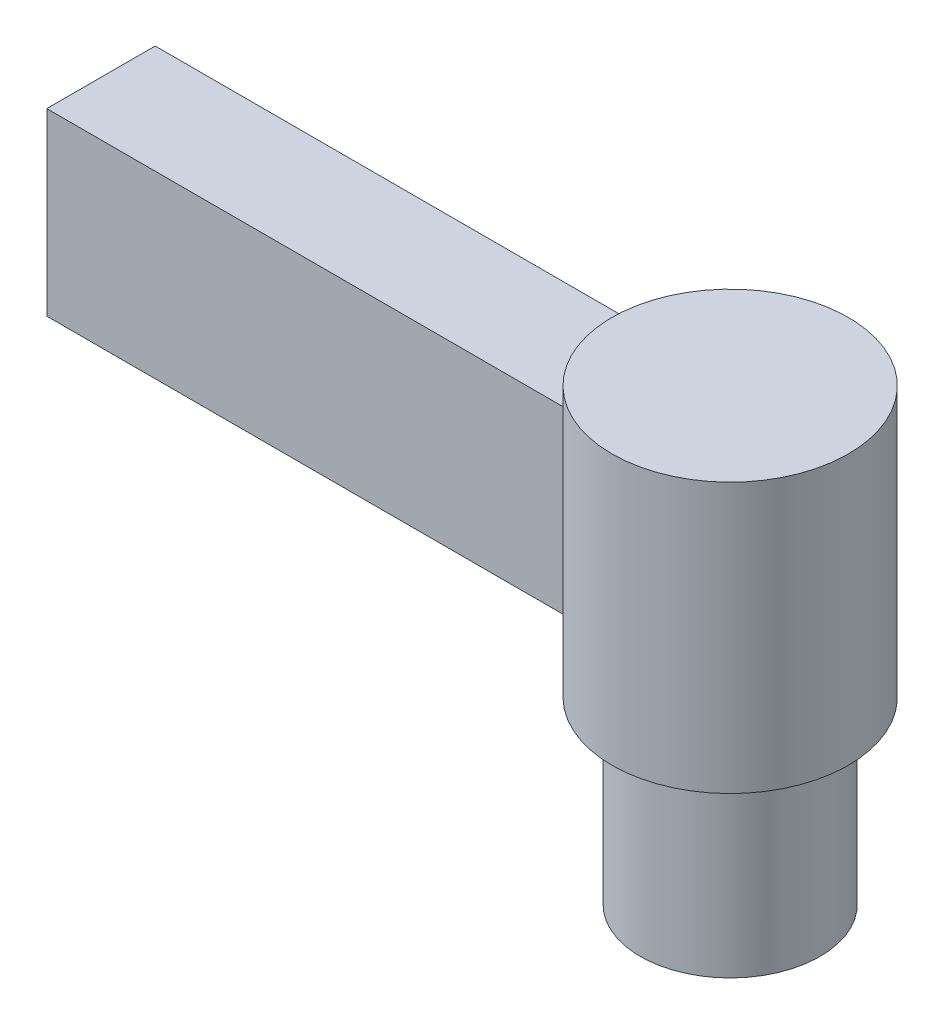
ISO-10303-21;
HEADER;
FILE_DESCRIPTION(('STEP AP214'),'2;1');
FILE_NAME('part.step','',(''),(''),'','','');
FILE_SCHEMA(('AUTOMOTIVE_DESIGN { 1 0 10303 214 1 1 1 1 }'));
ENDSEC;
DATA;
#1=APPLICATION_CONTEXT('core data for automotive mechanical design processes');
#2=APPLICATION_PROTOCOL_DEFINITION('international standard','automotive_design',2000,#1);
#3=PRODUCT_CONTEXT('',#1,'mechanical');
#4=PRODUCT('Part','Part','',(#3));
#5=PRODUCT_RELATED_PRODUCT_CATEGORY('part','',(#4));
#6=PRODUCT_DEFINITION_FORMATION('','',#4);
#7=PRODUCT_DEFINITION_CONTEXT('part definition',#1,'design');
#8=PRODUCT_DEFINITION('design','',#6,#7);
#9=PRODUCT_DEFINITION_SHAPE('','',#8);
#10=(LENGTH_UNIT() NAMED_UNIT(*) SI_UNIT(.MILLI.,.METRE.));
#11=(NAMED_UNIT(*) PLANE_ANGLE_UNIT() SI_UNIT($,.RADIAN.));
#12=(NAMED_UNIT(*) SI_UNIT($,.STERADIAN.) SOLID_ANGLE_UNIT());
#13=UNCERTAINTY_MEASURE_WITH_UNIT(LENGTH_MEASURE(1.E-05),#10,'distance_accuracy_value','');
#14=(GEOMETRIC_REPRESENTATION_CONTEXT(3) GLOBAL_UNCERTAINTY_ASSIGNED_CONTEXT((#13)) GLOBAL_UNIT_ASSIGNED_CONTEXT((#10,
#11,#12)) REPRESENTATION_CONTEXT('',''));
#15=CARTESIAN_POINT('',(0.,0.,0.));
#16=DIRECTION('',(0.,0.,1.));
#17=DIRECTION('',(1.,0.,0.));
#18=AXIS2_PLACEMENT_3D('',#15,#16,#17);
#19=CARTESIAN_POINT('',(0.,11.3392661829921,0.));
#20=DIRECTION('',(0.,-1.,0.));
#21=DIRECTION('',(0.,0.,-1.));
#22=AXIS2_PLACEMENT_3D('',#19,#20,#21);
#23=CYLINDRICAL_SURFACE('',#22,1.);
#24=CARTESIAN_POINT('',(0.,11.3392661829921,0.));
#25=DIRECTION('',(0.,1.,0.));
#26=DIRECTION('',(0.,0.,1.));
#27=AXIS2_PLACEMENT_3D('',#24,#25,#26);
#28=CIRCLE('',#27,1.);
#29=CARTESIAN_POINT('',(0.,11.3392661829921,1.));
#30=VERTEX_POINT('',#29);
#31=EDGE_CURVE('E103',#30,#30,#28,.F.);
#32=ORIENTED_EDGE('',*,*,#31,.T.);
#33=EDGE_LOOP('',(#32));
#34=FACE_BOUND('',#33,.T.);
#35=CARTESIAN_POINT('',(0.,9.33926618299213,0.));
#36=DIRECTION('',(0.,-1.,0.));
#37=DIRECTION('',(0.,0.,-1.));
#38=AXIS2_PLACEMENT_3D('',#35,#36,#37);
#39=CIRCLE('',#38,1.);
#40=CARTESIAN_POINT('',(0.,9.33926618299213,-1.));
#41=VERTEX_POINT('',#40);
#42=EDGE_CURVE('E108',#41,#41,#39,.T.);
#43=ORIENTED_EDGE('',*,*,#42,.F.);
#44=EDGE_LOOP('',(#43));
#45=FACE_BOUND('',#44,.T.);
#46=ADVANCED_FACE('F33',(#34,#45),#23,.T.);
#47=CARTESIAN_POINT('',(0.,9.33926618299213,0.));
#48=DIRECTION('',(0.,-1.,0.));
#49=DIRECTION('',(0.,0.,-1.));
#50=AXIS2_PLACEMENT_3D('',#47,#48,#49);
#51=PLANE('',#50);
#52=ORIENTED_EDGE('',*,*,#42,.T.);
#53=EDGE_LOOP('',(#52));
#54=FACE_BOUND('',#53,.T.);
#55=ADVANCED_FACE('F131',(#54),#51,.T.);
#56=CARTESIAN_POINT('',(0.,14.3392661829921,0.));
#57=DIRECTION('',(0.,-1.,0.));
#58=DIRECTION('',(0.,0.,-1.));
#59=AXIS2_PLACEMENT_3D('',#56,#57,#58);
#60=CYLINDRICAL_SURFACE('',#59,1.31538628900296);
#61=CARTESIAN_POINT('',(0.,11.8104094125294,0.));
#62=DIRECTION('',(0.,-1.,0.));
#63=DIRECTION('',(0.,0.,-1.));
#64=AXIS2_PLACEMENT_3D('',#61,#62,#63);
#65=CIRCLE('',#64,1.31538628900296);
#66=CARTESIAN_POINT('',(-1.16898579249988,11.8104094125294,0.603086483209836));
#67=VERTEX_POINT('',#66);
#68=CARTESIAN_POINT('',(-1.16898579249988,11.8104094125294,-0.603086483209836));
#69=VERTEX_POINT('',#68);
#70=EDGE_CURVE('E40',#67,#69,#65,.T.);
#71=ORIENTED_EDGE('',*,*,#70,.T.);
#72=DIRECTION('',(0.,-1.,0.));
#73=VECTOR('',#72,1.);
#74=CARTESIAN_POINT('',(-1.16898579249988,14.3392661829921,-0.603086483209836));
#75=LINE('',#74,#73);
#76=CARTESIAN_POINT('',(-1.16898579249988,13.8104094125294,-0.603086483209836));
#77=VERTEX_POINT('',#76);
#78=EDGE_CURVE('E11',#69,#77,#75,.F.);
#79=ORIENTED_EDGE('',*,*,#78,.T.);
#80=CARTESIAN_POINT('',(0.,13.8104094125294,0.));
#81=DIRECTION('',(0.,1.,0.));
#82=DIRECTION('',(0.,0.,1.));
#83=AXIS2_PLACEMENT_3D('',#80,#81,#82);
#84=CIRCLE('',#83,1.31538628900296);
#85=CARTESIAN_POINT('',(-1.16898579249988,13.8104094125294,0.603086483209836));
#86=VERTEX_POINT('',#85);
#87=EDGE_CURVE('E74',#77,#86,#84,.T.);
#88=ORIENTED_EDGE('',*,*,#87,.T.);
#89=DIRECTION('',(0.,-1.,0.));
#90=VECTOR('',#89,1.);
#91=CARTESIAN_POINT('',(-1.16898579249988,14.3392661829921,0.603086483209836));
#92=LINE('',#91,#90);
#93=EDGE_CURVE('E112',#86,#67,#92,.T.);
#94=ORIENTED_EDGE('',*,*,#93,.T.);
#95=EDGE_LOOP('',(#71,#79,#88,#94));
#96=FACE_BOUND('',#95,.T.);
#97=CARTESIAN_POINT('',(0.,14.3392661829921,0.));
#98=DIRECTION('',(0.,1.,0.));
#99=DIRECTION('',(0.,0.,1.));
#100=AXIS2_PLACEMENT_3D('',#97,#98,#99);
#101=CIRCLE('',#100,1.31538628900296);
#102=CARTESIAN_POINT('',(0.,14.3392661829921,1.31538628900296));
#103=VERTEX_POINT('',#102);
#104=EDGE_CURVE('E100',#103,#103,#101,.T.);
#105=ORIENTED_EDGE('',*,*,#104,.F.);
#106=EDGE_LOOP('',(#105));
#107=FACE_BOUND('',#106,.T.);
#108=CARTESIAN_POINT('',(0.,11.3392661829921,0.));
#109=DIRECTION('',(0.,1.,0.));
#110=DIRECTION('',(0.,0.,1.));
#111=AXIS2_PLACEMENT_3D('',#108,#109,#110);
#112=CIRCLE('',#111,1.31538628900296);
#113=CARTESIAN_POINT('',(0.,11.3392661829921,1.31538628900296));
#114=VERTEX_POINT('',#113);
#115=EDGE_CURVE('E95',#114,#114,#112,.T.);
#116=ORIENTED_EDGE('',*,*,#115,.T.);
#117=EDGE_LOOP('',(#116));
#118=FACE_BOUND('',#117,.T.);
#119=ADVANCED_FACE('F116',(#96,#107,#118),#60,.T.);
#120=CARTESIAN_POINT('',(0.,14.3392661829921,0.));
#121=DIRECTION('',(0.,1.,0.));
#122=DIRECTION('',(0.,0.,1.));
#123=AXIS2_PLACEMENT_3D('',#120,#121,#122);
#124=PLANE('',#123);
#125=ORIENTED_EDGE('',*,*,#104,.T.);
#126=EDGE_LOOP('',(#125));
#127=FACE_BOUND('',#126,.T.);
#128=ADVANCED_FACE('F144',(#127),#124,.T.);
#129=CARTESIAN_POINT('',(0.,11.3392661829921,0.));
#130=DIRECTION('',(0.,1.,0.));
#131=DIRECTION('',(0.,0.,1.));
#132=AXIS2_PLACEMENT_3D('',#129,#130,#131);
#133=PLANE('',#132);
#134=ORIENTED_EDGE('',*,*,#31,.F.);
#135=EDGE_LOOP('',(#134));
#136=FACE_BOUND('',#135,.T.);
#137=ORIENTED_EDGE('',*,*,#115,.F.);
#138=EDGE_LOOP('',(#137));
#139=FACE_BOUND('',#138,.T.);
#140=ADVANCED_FACE('F141',(#136,#139),#133,.F.);
#141=CARTESIAN_POINT('',(-7.00000000000001,11.8104094125294,-0.603086483209836));
#142=DIRECTION('',(0.,0.,-1.));
#143=DIRECTION('',(-1.,0.,0.));
#144=AXIS2_PLACEMENT_3D('',#141,#142,#143);
#145=PLANE('',#144);
#146=ORIENTED_EDGE('',*,*,#78,.F.);
#147=DIRECTION('',(1.,0.,0.));
#148=VECTOR('',#147,1.);
#149=CARTESIAN_POINT('',(-7.00000000000001,11.8104094125294,-0.603086483209836));
#150=LINE('',#149,#148);
#151=CARTESIAN_POINT('',(-7.00000000000001,11.8104094125294,-0.603086483209836));
#152=VERTEX_POINT('',#151);
#153=EDGE_CURVE('E89',#152,#69,#150,.T.);
#154=ORIENTED_EDGE('',*,*,#153,.F.);
#155=DIRECTION('',(0.,1.,0.));
#156=VECTOR('',#155,1.);
#157=CARTESIAN_POINT('',(-7.00000000000001,11.8104094125294,-0.603086483209836));
#158=LINE('',#157,#156);
#159=CARTESIAN_POINT('',(-7.00000000000001,13.8104094125294,-0.603086483209836));
#160=VERTEX_POINT('',#159);
#161=EDGE_CURVE('E83',#152,#160,#158,.T.);
#162=ORIENTED_EDGE('',*,*,#161,.T.);
#163=DIRECTION('',(1.,0.,0.));
#164=VECTOR('',#163,1.);
#165=CARTESIAN_POINT('',(-7.00000000000001,13.8104094125294,-0.603086483209836));
#166=LINE('',#165,#164);
#167=EDGE_CURVE('E69',#160,#77,#166,.T.);
#168=ORIENTED_EDGE('',*,*,#167,.T.);
#169=EDGE_LOOP('',(#146,#154,#162,#168));
#170=FACE_BOUND('',#169,.T.);
#171=ADVANCED_FACE('F88',(#170),#145,.T.);
#172=CARTESIAN_POINT('',(-7.00000000000001,11.8104094125294,0.603086483209836));
#173=DIRECTION('',(0.,-1.,0.));
#174=DIRECTION('',(0.,0.,-1.));
#175=AXIS2_PLACEMENT_3D('',#172,#173,#174);
#176=PLANE('',#175);
#177=ORIENTED_EDGE('',*,*,#70,.F.);
#178=DIRECTION('',(1.,0.,0.));
#179=VECTOR('',#178,1.);
#180=CARTESIAN_POINT('',(-7.00000000000001,11.8104094125294,0.603086483209836));
#181=LINE('',#180,#179);
#182=CARTESIAN_POINT('',(-7.00000000000001,11.8104094125294,0.603086483209836));
#183=VERTEX_POINT('',#182);
#184=EDGE_CURVE('E96',#183,#67,#181,.T.);
#185=ORIENTED_EDGE('',*,*,#184,.F.);
#186=DIRECTION('',(0.,0.,-1.));
#187=VECTOR('',#186,1.);
#188=CARTESIAN_POINT('',(-7.00000000000001,11.8104094125294,0.603086483209836));
#189=LINE('',#188,#187);
#190=EDGE_CURVE('E76',#183,#152,#189,.T.);
#191=ORIENTED_EDGE('',*,*,#190,.T.);
#192=ORIENTED_EDGE('',*,*,#153,.T.);
#193=EDGE_LOOP('',(#177,#185,#191,#192));
#194=FACE_BOUND('',#193,.T.);
#195=ADVANCED_FACE('F119',(#194),#176,.T.);
#196=CARTESIAN_POINT('',(-7.00000000000001,11.8104094125294,0.603086483209836));
#197=DIRECTION('',(0.,0.,1.));
#198=DIRECTION('',(1.,0.,0.));
#199=AXIS2_PLACEMENT_3D('',#196,#197,#198);
#200=PLANE('',#199);
#201=ORIENTED_EDGE('',*,*,#93,.F.);
#202=DIRECTION('',(1.,0.,0.));
#203=VECTOR('',#202,1.);
#204=CARTESIAN_POINT('',(-7.00000000000001,13.8104094125294,0.603086483209836));
#205=LINE('',#204,#203);
#206=CARTESIAN_POINT('',(-7.00000000000001,13.8104094125294,0.603086483209836));
#207=VERTEX_POINT('',#206);
#208=EDGE_CURVE('E47',#207,#86,#205,.T.);
#209=ORIENTED_EDGE('',*,*,#208,.F.);
#210=DIRECTION('',(0.,-1.,0.));
#211=VECTOR('',#210,1.);
#212=CARTESIAN_POINT('',(-7.00000000000001,11.8104094125294,0.603086483209836));
#213=LINE('',#212,#211);
#214=EDGE_CURVE('E86',#207,#183,#213,.T.);
#215=ORIENTED_EDGE('',*,*,#214,.T.);
#216=ORIENTED_EDGE('',*,*,#184,.T.);
#217=EDGE_LOOP('',(#201,#209,#215,#216));
#218=FACE_BOUND('',#217,.T.);
#219=ADVANCED_FACE('F121',(#218),#200,.T.);
#220=CARTESIAN_POINT('',(-7.00000000000001,13.8104094125294,0.603086483209836));
#221=DIRECTION('',(0.,1.,0.));
#222=DIRECTION('',(0.,0.,1.));
#223=AXIS2_PLACEMENT_3D('',#220,#221,#222);
#224=PLANE('',#223);
#225=ORIENTED_EDGE('',*,*,#87,.F.);
#226=ORIENTED_EDGE('',*,*,#167,.F.);
#227=DIRECTION('',(0.,0.,1.));
#228=VECTOR('',#227,1.);
#229=CARTESIAN_POINT('',(-7.00000000000001,13.8104094125294,0.603086483209836));
#230=LINE('',#229,#228);
#231=EDGE_CURVE('E72',#160,#207,#230,.T.);
#232=ORIENTED_EDGE('',*,*,#231,.T.);
#233=ORIENTED_EDGE('',*,*,#208,.T.);
#234=EDGE_LOOP('',(#225,#226,#232,#233));
#235=FACE_BOUND('',#234,.T.);
#236=ADVANCED_FACE('F71',(#235),#224,.T.);
#237=CARTESIAN_POINT('',(-7.00000000000001,0.,0.));
#238=DIRECTION('',(-1.,0.,0.));
#239=DIRECTION('',(0.,0.,1.));
#240=AXIS2_PLACEMENT_3D('',#237,#238,#239);
#241=PLANE('',#240);
#242=ORIENTED_EDGE('',*,*,#161,.F.);
#243=ORIENTED_EDGE('',*,*,#190,.F.);
#244=ORIENTED_EDGE('',*,*,#214,.F.);
#245=ORIENTED_EDGE('',*,*,#231,.F.);
#246=EDGE_LOOP('',(#242,#243,#244,#245));
#247=FACE_BOUND('',#246,.T.);
#248=ADVANCED_FACE('F81',(#247),#241,.T.);
#249=CLOSED_SHELL('',(#46,#55,#119,#128,#140,#171,#195,#219,#236,#248));
#250=MANIFOLD_SOLID_BREP('B2',#249);
#251=ADVANCED_BREP_SHAPE_REPRESENTATION('',(#18,#250),#14);
#252=SHAPE_DEFINITION_REPRESENTATION(#9,#251);
ENDSEC;
END-ISO-10303-21;
